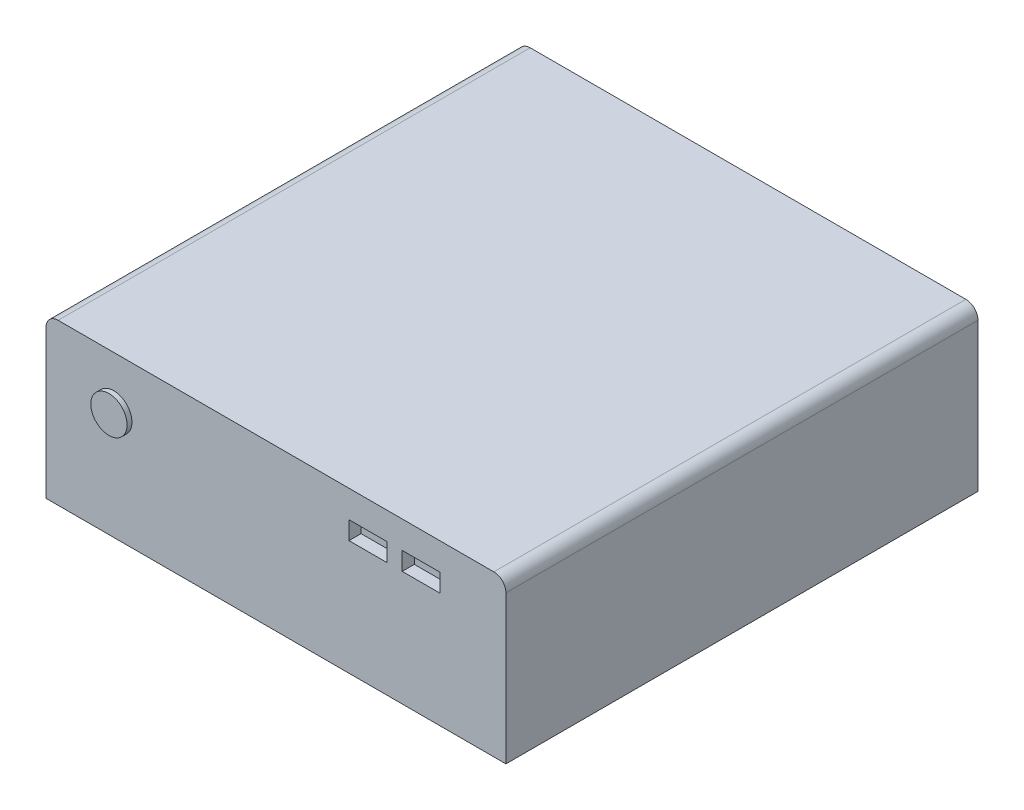
ISO-10303-21;
HEADER;
FILE_DESCRIPTION(('STEP AP214'),'2;1');
FILE_NAME('part.step','',(''),(''),'','','');
FILE_SCHEMA(('AUTOMOTIVE_DESIGN { 1 0 10303 214 1 1 1 1 }'));
ENDSEC;
DATA;
#1=APPLICATION_CONTEXT('core data for automotive mechanical design processes');
#2=APPLICATION_PROTOCOL_DEFINITION('international standard','automotive_design',2000,#1);
#3=PRODUCT_CONTEXT('',#1,'mechanical');
#4=PRODUCT('Part','Part','',(#3));
#5=PRODUCT_RELATED_PRODUCT_CATEGORY('part','',(#4));
#6=PRODUCT_DEFINITION_FORMATION('','',#4);
#7=PRODUCT_DEFINITION_CONTEXT('part definition',#1,'design');
#8=PRODUCT_DEFINITION('design','',#6,#7);
#9=PRODUCT_DEFINITION_SHAPE('','',#8);
#10=(LENGTH_UNIT() NAMED_UNIT(*) SI_UNIT(.MILLI.,.METRE.));
#11=(NAMED_UNIT(*) PLANE_ANGLE_UNIT() SI_UNIT($,.RADIAN.));
#12=(NAMED_UNIT(*) SI_UNIT($,.STERADIAN.) SOLID_ANGLE_UNIT());
#13=UNCERTAINTY_MEASURE_WITH_UNIT(LENGTH_MEASURE(1.E-05),#10,'distance_accuracy_value','');
#14=(GEOMETRIC_REPRESENTATION_CONTEXT(3) GLOBAL_UNCERTAINTY_ASSIGNED_CONTEXT((#13)) GLOBAL_UNIT_ASSIGNED_CONTEXT((#10,
#11,#12)) REPRESENTATION_CONTEXT('',''));
#15=CARTESIAN_POINT('',(0.,0.,0.));
#16=DIRECTION('',(0.,0.,1.));
#17=DIRECTION('',(1.,0.,0.));
#18=AXIS2_PLACEMENT_3D('',#15,#16,#17);
#19=CARTESIAN_POINT('',(-95.,66.2,97.5));
#20=DIRECTION('',(0.,0.,-1.));
#21=DIRECTION('',(-1.,0.,0.));
#22=AXIS2_PLACEMENT_3D('',#19,#20,#21);
#23=PLANE('',#22);
#24=DIRECTION('',(1.,0.,0.));
#25=VECTOR('',#24,1.);
#26=CARTESIAN_POINT('',(67.85,47.45,97.5));
#27=LINE('',#26,#25);
#28=CARTESIAN_POINT('',(52.15,47.45,97.5));
#29=VERTEX_POINT('',#28);
#30=CARTESIAN_POINT('',(67.85,47.45,97.5));
#31=VERTEX_POINT('',#30);
#32=EDGE_CURVE('E162',#29,#31,#27,.T.);
#33=ORIENTED_EDGE('',*,*,#32,.F.);
#34=DIRECTION('',(0.,-1.,0.));
#35=VECTOR('',#34,1.);
#36=CARTESIAN_POINT('',(52.15,47.45,97.5));
#37=LINE('',#36,#35);
#38=CARTESIAN_POINT('',(52.15,54.95,97.5));
#39=VERTEX_POINT('',#38);
#40=EDGE_CURVE('E47',#39,#29,#37,.T.);
#41=ORIENTED_EDGE('',*,*,#40,.F.);
#42=DIRECTION('',(-1.,0.,0.));
#43=VECTOR('',#42,1.);
#44=CARTESIAN_POINT('',(67.85,54.95,97.5));
#45=LINE('',#44,#43);
#46=CARTESIAN_POINT('',(67.85,54.95,97.5));
#47=VERTEX_POINT('',#46);
#48=EDGE_CURVE('E153',#47,#39,#45,.T.);
#49=ORIENTED_EDGE('',*,*,#48,.F.);
#50=DIRECTION('',(0.,1.,0.));
#51=VECTOR('',#50,1.);
#52=CARTESIAN_POINT('',(67.85,47.45,97.5));
#53=LINE('',#52,#51);
#54=EDGE_CURVE('E156',#31,#47,#53,.T.);
#55=ORIENTED_EDGE('',*,*,#54,.F.);
#56=EDGE_LOOP('',(#33,#41,#49,#55));
#57=FACE_BOUND('',#56,.T.);
#58=DIRECTION('',(1.,0.,0.));
#59=VECTOR('',#58,1.);
#60=CARTESIAN_POINT('',(45.85,47.45,97.5));
#61=LINE('',#60,#59);
#62=CARTESIAN_POINT('',(30.15,47.45,97.5));
#63=VERTEX_POINT('',#62);
#64=CARTESIAN_POINT('',(45.85,47.45,97.5));
#65=VERTEX_POINT('',#64);
#66=EDGE_CURVE('E186',#63,#65,#61,.T.);
#67=ORIENTED_EDGE('',*,*,#66,.F.);
#68=DIRECTION('',(0.,-1.,0.));
#69=VECTOR('',#68,1.);
#70=CARTESIAN_POINT('',(30.15,47.45,97.5));
#71=LINE('',#70,#69);
#72=CARTESIAN_POINT('',(30.15,54.95,97.5));
#73=VERTEX_POINT('',#72);
#74=EDGE_CURVE('E55',#73,#63,#71,.T.);
#75=ORIENTED_EDGE('',*,*,#74,.F.);
#76=DIRECTION('',(-1.,0.,0.));
#77=VECTOR('',#76,1.);
#78=CARTESIAN_POINT('',(45.85,54.95,97.5));
#79=LINE('',#78,#77);
#80=CARTESIAN_POINT('',(45.85,54.95,97.5));
#81=VERTEX_POINT('',#80);
#82=EDGE_CURVE('E175',#81,#73,#79,.T.);
#83=ORIENTED_EDGE('',*,*,#82,.F.);
#84=DIRECTION('',(0.,1.,0.));
#85=VECTOR('',#84,1.);
#86=CARTESIAN_POINT('',(45.85,47.45,97.5));
#87=LINE('',#86,#85);
#88=EDGE_CURVE('E189',#65,#81,#87,.T.);
#89=ORIENTED_EDGE('',*,*,#88,.F.);
#90=EDGE_LOOP('',(#67,#75,#83,#89));
#91=FACE_BOUND('',#90,.T.);
#92=DIRECTION('',(0.,-1.,0.));
#93=VECTOR('',#92,1.);
#94=CARTESIAN_POINT('',(95.,66.2,97.5));
#95=LINE('',#94,#93);
#96=CARTESIAN_POINT('',(95.,61.2,97.5));
#97=VERTEX_POINT('',#96);
#98=CARTESIAN_POINT('',(95.,0.,97.5));
#99=VERTEX_POINT('',#98);
#100=EDGE_CURVE('E236',#97,#99,#95,.T.);
#101=ORIENTED_EDGE('',*,*,#100,.F.);
#102=CARTESIAN_POINT('',(90.,61.2,97.5));
#103=DIRECTION('',(0.,0.,-1.));
#104=DIRECTION('',(-1.,0.,0.));
#105=AXIS2_PLACEMENT_3D('',#102,#103,#104);
#106=CIRCLE('',#105,5.);
#107=CARTESIAN_POINT('',(90.,66.2,97.5));
#108=VERTEX_POINT('',#107);
#109=EDGE_CURVE('E268',#97,#108,#106,.F.);
#110=ORIENTED_EDGE('',*,*,#109,.T.);
#111=DIRECTION('',(1.,0.,0.));
#112=VECTOR('',#111,1.);
#113=CARTESIAN_POINT('',(-95.,66.2,97.5));
#114=LINE('',#113,#112);
#115=CARTESIAN_POINT('',(-90.,66.2,97.5));
#116=VERTEX_POINT('',#115);
#117=EDGE_CURVE('E232',#116,#108,#114,.T.);
#118=ORIENTED_EDGE('',*,*,#117,.F.);
#119=CARTESIAN_POINT('',(-90.,61.2,97.5));
#120=DIRECTION('',(0.,0.,-1.));
#121=DIRECTION('',(-1.,0.,0.));
#122=AXIS2_PLACEMENT_3D('',#119,#120,#121);
#123=CIRCLE('',#122,5.);
#124=CARTESIAN_POINT('',(-95.,61.2,97.5));
#125=VERTEX_POINT('',#124);
#126=EDGE_CURVE('E266',#116,#125,#123,.F.);
#127=ORIENTED_EDGE('',*,*,#126,.T.);
#128=DIRECTION('',(0.,-1.,0.));
#129=VECTOR('',#128,1.);
#130=CARTESIAN_POINT('',(-95.,66.2,97.5));
#131=LINE('',#130,#129);
#132=CARTESIAN_POINT('',(-95.,0.,97.5));
#133=VERTEX_POINT('',#132);
#134=EDGE_CURVE('E248',#125,#133,#131,.T.);
#135=ORIENTED_EDGE('',*,*,#134,.T.);
#136=DIRECTION('',(1.,0.,0.));
#137=VECTOR('',#136,1.);
#138=CARTESIAN_POINT('',(-95.,0.,97.5));
#139=LINE('',#138,#137);
#140=EDGE_CURVE('E233',#133,#99,#139,.T.);
#141=ORIENTED_EDGE('',*,*,#140,.T.);
#142=EDGE_LOOP('',(#101,#110,#118,#127,#135,#141));
#143=FACE_BOUND('',#142,.T.);
#144=CARTESIAN_POINT('',(-67.,45.,97.5));
#145=DIRECTION('',(0.,0.,-1.));
#146=DIRECTION('',(-1.,0.,0.));
#147=AXIS2_PLACEMENT_3D('',#144,#145,#146);
#148=CIRCLE('',#147,7.5);
#149=CARTESIAN_POINT('',(-74.5,45.,97.5));
#150=VERTEX_POINT('',#149);
#151=EDGE_CURVE('E11',#150,#150,#148,.F.);
#152=ORIENTED_EDGE('',*,*,#151,.F.);
#153=EDGE_LOOP('',(#152));
#154=FACE_BOUND('',#153,.T.);
#155=ADVANCED_FACE('F32',(#57,#91,#143,#154),#23,.F.);
#156=CARTESIAN_POINT('',(95.,66.2,-97.5));
#157=DIRECTION('',(-1.,0.,0.));
#158=DIRECTION('',(0.,0.,1.));
#159=AXIS2_PLACEMENT_3D('',#156,#157,#158);
#160=PLANE('',#159);
#161=DIRECTION('',(0.,-1.,0.));
#162=VECTOR('',#161,1.);
#163=CARTESIAN_POINT('',(95.,66.2,-97.5));
#164=LINE('',#163,#162);
#165=CARTESIAN_POINT('',(95.,61.2,-97.5));
#166=VERTEX_POINT('',#165);
#167=CARTESIAN_POINT('',(95.,0.,-97.5));
#168=VERTEX_POINT('',#167);
#169=EDGE_CURVE('E252',#166,#168,#164,.T.);
#170=ORIENTED_EDGE('',*,*,#169,.F.);
#171=DIRECTION('',(0.,0.,-1.));
#172=VECTOR('',#171,1.);
#173=CARTESIAN_POINT('',(95.,61.2,97.5));
#174=LINE('',#173,#172);
#175=EDGE_CURVE('E264',#166,#97,#174,.F.);
#176=ORIENTED_EDGE('',*,*,#175,.T.);
#177=ORIENTED_EDGE('',*,*,#100,.T.);
#178=DIRECTION('',(0.,0.,-1.));
#179=VECTOR('',#178,1.);
#180=CARTESIAN_POINT('',(95.,0.,-97.5));
#181=LINE('',#180,#179);
#182=EDGE_CURVE('E226',#99,#168,#181,.T.);
#183=ORIENTED_EDGE('',*,*,#182,.T.);
#184=EDGE_LOOP('',(#170,#176,#177,#183));
#185=FACE_BOUND('',#184,.T.);
#186=ADVANCED_FACE('F295',(#185),#160,.F.);
#187=CARTESIAN_POINT('',(-95.,66.2,-97.5));
#188=DIRECTION('',(0.,0.,1.));
#189=DIRECTION('',(1.,0.,0.));
#190=AXIS2_PLACEMENT_3D('',#187,#188,#189);
#191=PLANE('',#190);
#192=DIRECTION('',(-1.,0.,0.));
#193=VECTOR('',#192,1.);
#194=CARTESIAN_POINT('',(-95.,66.2,-97.5));
#195=LINE('',#194,#193);
#196=CARTESIAN_POINT('',(90.,66.2,-97.5));
#197=VERTEX_POINT('',#196);
#198=CARTESIAN_POINT('',(-90.,66.2,-97.5));
#199=VERTEX_POINT('',#198);
#200=EDGE_CURVE('E229',#197,#199,#195,.T.);
#201=ORIENTED_EDGE('',*,*,#200,.F.);
#202=CARTESIAN_POINT('',(90.,61.2,-97.5));
#203=DIRECTION('',(0.,0.,1.));
#204=DIRECTION('',(1.,0.,0.));
#205=AXIS2_PLACEMENT_3D('',#202,#203,#204);
#206=CIRCLE('',#205,5.);
#207=EDGE_CURVE('E262',#197,#166,#206,.F.);
#208=ORIENTED_EDGE('',*,*,#207,.T.);
#209=ORIENTED_EDGE('',*,*,#169,.T.);
#210=DIRECTION('',(-1.,0.,0.));
#211=VECTOR('',#210,1.);
#212=CARTESIAN_POINT('',(-95.,0.,-97.5));
#213=LINE('',#212,#211);
#214=CARTESIAN_POINT('',(-95.,0.,-97.5));
#215=VERTEX_POINT('',#214);
#216=EDGE_CURVE('E239',#168,#215,#213,.T.);
#217=ORIENTED_EDGE('',*,*,#216,.T.);
#218=DIRECTION('',(0.,-1.,0.));
#219=VECTOR('',#218,1.);
#220=CARTESIAN_POINT('',(-95.,66.2,-97.5));
#221=LINE('',#220,#219);
#222=CARTESIAN_POINT('',(-95.,61.2,-97.5));
#223=VERTEX_POINT('',#222);
#224=EDGE_CURVE('E250',#223,#215,#221,.T.);
#225=ORIENTED_EDGE('',*,*,#224,.F.);
#226=CARTESIAN_POINT('',(-90.,61.2,-97.5));
#227=DIRECTION('',(0.,0.,1.));
#228=DIRECTION('',(1.,0.,0.));
#229=AXIS2_PLACEMENT_3D('',#226,#227,#228);
#230=CIRCLE('',#229,5.);
#231=EDGE_CURVE('E260',#223,#199,#230,.F.);
#232=ORIENTED_EDGE('',*,*,#231,.T.);
#233=EDGE_LOOP('',(#201,#208,#209,#217,#225,#232));
#234=FACE_BOUND('',#233,.T.);
#235=ADVANCED_FACE('F278',(#234),#191,.F.);
#236=CARTESIAN_POINT('',(-95.,66.2,-97.5));
#237=DIRECTION('',(1.,0.,0.));
#238=DIRECTION('',(0.,0.,-1.));
#239=AXIS2_PLACEMENT_3D('',#236,#237,#238);
#240=PLANE('',#239);
#241=ORIENTED_EDGE('',*,*,#134,.F.);
#242=DIRECTION('',(0.,0.,1.));
#243=VECTOR('',#242,1.);
#244=CARTESIAN_POINT('',(-95.,61.2,-97.5));
#245=LINE('',#244,#243);
#246=EDGE_CURVE('E40',#125,#223,#245,.F.);
#247=ORIENTED_EDGE('',*,*,#246,.T.);
#248=ORIENTED_EDGE('',*,*,#224,.T.);
#249=DIRECTION('',(0.,0.,1.));
#250=VECTOR('',#249,1.);
#251=CARTESIAN_POINT('',(-95.,0.,-97.5));
#252=LINE('',#251,#250);
#253=EDGE_CURVE('E242',#215,#133,#252,.T.);
#254=ORIENTED_EDGE('',*,*,#253,.T.);
#255=EDGE_LOOP('',(#241,#247,#248,#254));
#256=FACE_BOUND('',#255,.T.);
#257=ADVANCED_FACE('F273',(#256),#240,.F.);
#258=CARTESIAN_POINT('',(0.,66.2,0.));
#259=DIRECTION('',(0.,1.,0.));
#260=DIRECTION('',(0.,0.,1.));
#261=AXIS2_PLACEMENT_3D('',#258,#259,#260);
#262=PLANE('',#261);
#263=ORIENTED_EDGE('',*,*,#117,.T.);
#264=DIRECTION('',(0.,0.,-1.));
#265=VECTOR('',#264,1.);
#266=CARTESIAN_POINT('',(90.,66.2,-97.5));
#267=LINE('',#266,#265);
#268=EDGE_CURVE('E257',#108,#197,#267,.T.);
#269=ORIENTED_EDGE('',*,*,#268,.T.);
#270=ORIENTED_EDGE('',*,*,#200,.T.);
#271=DIRECTION('',(0.,0.,1.));
#272=VECTOR('',#271,1.);
#273=CARTESIAN_POINT('',(-90.,66.2,97.5));
#274=LINE('',#273,#272);
#275=EDGE_CURVE('E254',#199,#116,#274,.T.);
#276=ORIENTED_EDGE('',*,*,#275,.T.);
#277=EDGE_LOOP('',(#263,#269,#270,#276));
#278=FACE_BOUND('',#277,.T.);
#279=ADVANCED_FACE('F284',(#278),#262,.T.);
#280=CARTESIAN_POINT('',(0.,0.,0.));
#281=DIRECTION('',(0.,1.,0.));
#282=DIRECTION('',(0.,0.,1.));
#283=AXIS2_PLACEMENT_3D('',#280,#281,#282);
#284=PLANE('',#283);
#285=CARTESIAN_POINT('',(-85.725,0.,-45.));
#286=DIRECTION('',(0.,-1.,0.));
#287=DIRECTION('',(0.,0.,-1.));
#288=AXIS2_PLACEMENT_3D('',#285,#286,#287);
#289=CIRCLE('',#288,1.70000000000001);
#290=CARTESIAN_POINT('',(-85.725,0.,-46.7));
#291=VERTEX_POINT('',#290);
#292=EDGE_CURVE('E204',#291,#291,#289,.T.);
#293=ORIENTED_EDGE('',*,*,#292,.F.);
#294=EDGE_LOOP('',(#293));
#295=FACE_BOUND('',#294,.T.);
#296=CARTESIAN_POINT('',(85.725,0.,-45.));
#297=DIRECTION('',(0.,-1.,0.));
#298=DIRECTION('',(0.,0.,-1.));
#299=AXIS2_PLACEMENT_3D('',#296,#297,#298);
#300=CIRCLE('',#299,1.70000000000001);
#301=CARTESIAN_POINT('',(85.725,0.,-46.7));
#302=VERTEX_POINT('',#301);
#303=EDGE_CURVE('E208',#302,#302,#300,.T.);
#304=ORIENTED_EDGE('',*,*,#303,.F.);
#305=EDGE_LOOP('',(#304));
#306=FACE_BOUND('',#305,.T.);
#307=CARTESIAN_POINT('',(85.725,0.,45.));
#308=DIRECTION('',(0.,-1.,0.));
#309=DIRECTION('',(0.,0.,-1.));
#310=AXIS2_PLACEMENT_3D('',#307,#308,#309);
#311=CIRCLE('',#310,1.70000000000001);
#312=CARTESIAN_POINT('',(85.725,0.,43.3));
#313=VERTEX_POINT('',#312);
#314=EDGE_CURVE('E214',#313,#313,#311,.T.);
#315=ORIENTED_EDGE('',*,*,#314,.F.);
#316=EDGE_LOOP('',(#315));
#317=FACE_BOUND('',#316,.T.);
#318=CARTESIAN_POINT('',(-85.725,0.,45.));
#319=DIRECTION('',(0.,-1.,0.));
#320=DIRECTION('',(0.,0.,-1.));
#321=AXIS2_PLACEMENT_3D('',#318,#319,#320);
#322=CIRCLE('',#321,1.70000000000001);
#323=CARTESIAN_POINT('',(-85.725,0.,43.3));
#324=VERTEX_POINT('',#323);
#325=EDGE_CURVE('E220',#324,#324,#322,.T.);
#326=ORIENTED_EDGE('',*,*,#325,.F.);
#327=EDGE_LOOP('',(#326));
#328=FACE_BOUND('',#327,.T.);
#329=ORIENTED_EDGE('',*,*,#182,.F.);
#330=ORIENTED_EDGE('',*,*,#140,.F.);
#331=ORIENTED_EDGE('',*,*,#253,.F.);
#332=ORIENTED_EDGE('',*,*,#216,.F.);
#333=EDGE_LOOP('',(#329,#330,#331,#332));
#334=FACE_BOUND('',#333,.T.);
#335=ADVANCED_FACE('F299',(#295,#306,#317,#328,#334),#284,.F.);
#336=CARTESIAN_POINT('',(90.,61.2,0.));
#337=DIRECTION('',(0.,0.,1.));
#338=DIRECTION('',(1.,0.,0.));
#339=AXIS2_PLACEMENT_3D('',#336,#337,#338);
#340=CYLINDRICAL_SURFACE('',#339,5.);
#341=ORIENTED_EDGE('',*,*,#109,.F.);
#342=ORIENTED_EDGE('',*,*,#175,.F.);
#343=ORIENTED_EDGE('',*,*,#207,.F.);
#344=ORIENTED_EDGE('',*,*,#268,.F.);
#345=EDGE_LOOP('',(#341,#342,#343,#344));
#346=FACE_BOUND('',#345,.T.);
#347=ADVANCED_FACE('F292',(#346),#340,.T.);
#348=CARTESIAN_POINT('',(-90.,61.2,0.));
#349=DIRECTION('',(0.,0.,-1.));
#350=DIRECTION('',(-1.,0.,0.));
#351=AXIS2_PLACEMENT_3D('',#348,#349,#350);
#352=CYLINDRICAL_SURFACE('',#351,5.);
#353=ORIENTED_EDGE('',*,*,#231,.F.);
#354=ORIENTED_EDGE('',*,*,#246,.F.);
#355=ORIENTED_EDGE('',*,*,#126,.F.);
#356=ORIENTED_EDGE('',*,*,#275,.F.);
#357=EDGE_LOOP('',(#353,#354,#355,#356));
#358=FACE_BOUND('',#357,.T.);
#359=ADVANCED_FACE('F34',(#358),#352,.T.);
#360=CARTESIAN_POINT('',(-85.725,5.,45.));
#361=DIRECTION('',(0.,-1.,0.));
#362=DIRECTION('',(0.,0.,-1.));
#363=AXIS2_PLACEMENT_3D('',#360,#361,#362);
#364=CYLINDRICAL_SURFACE('',#363,1.70000000000001);
#365=CARTESIAN_POINT('',(-85.725,5.,45.));
#366=DIRECTION('',(0.,-1.,0.));
#367=DIRECTION('',(0.,0.,-1.));
#368=AXIS2_PLACEMENT_3D('',#365,#366,#367);
#369=CIRCLE('',#368,1.70000000000001);
#370=CARTESIAN_POINT('',(-85.725,5.,43.3));
#371=VERTEX_POINT('',#370);
#372=EDGE_CURVE('E223',#371,#371,#369,.T.);
#373=ORIENTED_EDGE('',*,*,#372,.F.);
#374=EDGE_LOOP('',(#373));
#375=FACE_BOUND('',#374,.T.);
#376=ORIENTED_EDGE('',*,*,#325,.T.);
#377=EDGE_LOOP('',(#376));
#378=FACE_BOUND('',#377,.T.);
#379=ADVANCED_FACE('F349',(#375,#378),#364,.F.);
#380=CARTESIAN_POINT('',(-85.725,5.,45.));
#381=DIRECTION('',(0.,-1.,0.));
#382=DIRECTION('',(0.,0.,-1.));
#383=AXIS2_PLACEMENT_3D('',#380,#381,#382);
#384=PLANE('',#383);
#385=ORIENTED_EDGE('',*,*,#372,.T.);
#386=EDGE_LOOP('',(#385));
#387=FACE_BOUND('',#386,.T.);
#388=ADVANCED_FACE('F361',(#387),#384,.T.);
#389=CARTESIAN_POINT('',(85.725,5.,45.));
#390=DIRECTION('',(0.,-1.,0.));
#391=DIRECTION('',(0.,0.,-1.));
#392=AXIS2_PLACEMENT_3D('',#389,#390,#391);
#393=CYLINDRICAL_SURFACE('',#392,1.70000000000001);
#394=CARTESIAN_POINT('',(85.725,5.,45.));
#395=DIRECTION('',(0.,-1.,0.));
#396=DIRECTION('',(0.,0.,-1.));
#397=AXIS2_PLACEMENT_3D('',#394,#395,#396);
#398=CIRCLE('',#397,1.70000000000001);
#399=CARTESIAN_POINT('',(85.725,5.,43.3));
#400=VERTEX_POINT('',#399);
#401=EDGE_CURVE('E217',#400,#400,#398,.T.);
#402=ORIENTED_EDGE('',*,*,#401,.F.);
#403=EDGE_LOOP('',(#402));
#404=FACE_BOUND('',#403,.T.);
#405=ORIENTED_EDGE('',*,*,#314,.T.);
#406=EDGE_LOOP('',(#405));
#407=FACE_BOUND('',#406,.T.);
#408=ADVANCED_FACE('F371',(#404,#407),#393,.F.);
#409=CARTESIAN_POINT('',(85.725,5.,45.));
#410=DIRECTION('',(0.,-1.,0.));
#411=DIRECTION('',(0.,0.,-1.));
#412=AXIS2_PLACEMENT_3D('',#409,#410,#411);
#413=PLANE('',#412);
#414=ORIENTED_EDGE('',*,*,#401,.T.);
#415=EDGE_LOOP('',(#414));
#416=FACE_BOUND('',#415,.T.);
#417=ADVANCED_FACE('F381',(#416),#413,.T.);
#418=CARTESIAN_POINT('',(85.725,5.,-45.));
#419=DIRECTION('',(0.,-1.,0.));
#420=DIRECTION('',(0.,0.,-1.));
#421=AXIS2_PLACEMENT_3D('',#418,#419,#420);
#422=CYLINDRICAL_SURFACE('',#421,1.70000000000001);
#423=CARTESIAN_POINT('',(85.725,5.,-45.));
#424=DIRECTION('',(0.,-1.,0.));
#425=DIRECTION('',(0.,0.,-1.));
#426=AXIS2_PLACEMENT_3D('',#423,#424,#425);
#427=CIRCLE('',#426,1.70000000000001);
#428=CARTESIAN_POINT('',(85.725,5.,-46.7));
#429=VERTEX_POINT('',#428);
#430=EDGE_CURVE('E211',#429,#429,#427,.T.);
#431=ORIENTED_EDGE('',*,*,#430,.F.);
#432=EDGE_LOOP('',(#431));
#433=FACE_BOUND('',#432,.T.);
#434=ORIENTED_EDGE('',*,*,#303,.T.);
#435=EDGE_LOOP('',(#434));
#436=FACE_BOUND('',#435,.T.);
#437=ADVANCED_FACE('F391',(#433,#436),#422,.F.);
#438=CARTESIAN_POINT('',(85.725,5.,-45.));
#439=DIRECTION('',(0.,-1.,0.));
#440=DIRECTION('',(0.,0.,-1.));
#441=AXIS2_PLACEMENT_3D('',#438,#439,#440);
#442=PLANE('',#441);
#443=ORIENTED_EDGE('',*,*,#430,.T.);
#444=EDGE_LOOP('',(#443));
#445=FACE_BOUND('',#444,.T.);
#446=ADVANCED_FACE('F401',(#445),#442,.T.);
#447=CARTESIAN_POINT('',(-85.725,5.,-45.));
#448=DIRECTION('',(0.,-1.,0.));
#449=DIRECTION('',(0.,0.,-1.));
#450=AXIS2_PLACEMENT_3D('',#447,#448,#449);
#451=CYLINDRICAL_SURFACE('',#450,1.70000000000001);
#452=CARTESIAN_POINT('',(-85.725,5.,-45.));
#453=DIRECTION('',(0.,-1.,0.));
#454=DIRECTION('',(0.,0.,-1.));
#455=AXIS2_PLACEMENT_3D('',#452,#453,#454);
#456=CIRCLE('',#455,1.70000000000001);
#457=CARTESIAN_POINT('',(-85.725,5.,-46.7));
#458=VERTEX_POINT('',#457);
#459=EDGE_CURVE('E205',#458,#458,#456,.T.);
#460=ORIENTED_EDGE('',*,*,#459,.F.);
#461=EDGE_LOOP('',(#460));
#462=FACE_BOUND('',#461,.T.);
#463=ORIENTED_EDGE('',*,*,#292,.T.);
#464=EDGE_LOOP('',(#463));
#465=FACE_BOUND('',#464,.T.);
#466=ADVANCED_FACE('F411',(#462,#465),#451,.F.);
#467=CARTESIAN_POINT('',(-85.725,5.,-45.));
#468=DIRECTION('',(0.,-1.,0.));
#469=DIRECTION('',(0.,0.,-1.));
#470=AXIS2_PLACEMENT_3D('',#467,#468,#469);
#471=PLANE('',#470);
#472=ORIENTED_EDGE('',*,*,#459,.T.);
#473=EDGE_LOOP('',(#472));
#474=FACE_BOUND('',#473,.T.);
#475=ADVANCED_FACE('F421',(#474),#471,.T.);
#476=CARTESIAN_POINT('',(-67.,45.,99.5));
#477=DIRECTION('',(0.,0.,-1.));
#478=DIRECTION('',(-1.,0.,0.));
#479=AXIS2_PLACEMENT_3D('',#476,#477,#478);
#480=CYLINDRICAL_SURFACE('',#479,7.5);
#481=CARTESIAN_POINT('',(-67.,45.,99.5));
#482=DIRECTION('',(0.,0.,1.));
#483=DIRECTION('',(1.,0.,0.));
#484=AXIS2_PLACEMENT_3D('',#481,#482,#483);
#485=CIRCLE('',#484,7.5);
#486=CARTESIAN_POINT('',(-59.5,45.,99.5));
#487=VERTEX_POINT('',#486);
#488=EDGE_CURVE('E196',#487,#487,#485,.T.);
#489=ORIENTED_EDGE('',*,*,#488,.F.);
#490=EDGE_LOOP('',(#489));
#491=FACE_BOUND('',#490,.T.);
#492=ORIENTED_EDGE('',*,*,#151,.T.);
#493=EDGE_LOOP('',(#492));
#494=FACE_BOUND('',#493,.T.);
#495=ADVANCED_FACE('F431',(#491,#494),#480,.T.);
#496=CARTESIAN_POINT('',(-67.,45.,99.5));
#497=DIRECTION('',(0.,0.,1.));
#498=DIRECTION('',(1.,0.,0.));
#499=AXIS2_PLACEMENT_3D('',#496,#497,#498);
#500=PLANE('',#499);
#501=ORIENTED_EDGE('',*,*,#488,.T.);
#502=EDGE_LOOP('',(#501));
#503=FACE_BOUND('',#502,.T.);
#504=ADVANCED_FACE('F442',(#503),#500,.T.);
#505=CARTESIAN_POINT('',(30.15,47.45,92.5));
#506=DIRECTION('',(-1.,0.,0.));
#507=DIRECTION('',(0.,0.,1.));
#508=AXIS2_PLACEMENT_3D('',#505,#506,#507);
#509=PLANE('',#508);
#510=ORIENTED_EDGE('',*,*,#74,.T.);
#511=DIRECTION('',(0.,0.,1.));
#512=VECTOR('',#511,1.);
#513=CARTESIAN_POINT('',(30.15,47.45,92.5));
#514=LINE('',#513,#512);
#515=CARTESIAN_POINT('',(30.15,47.45,92.5));
#516=VERTEX_POINT('',#515);
#517=EDGE_CURVE('E184',#516,#63,#514,.T.);
#518=ORIENTED_EDGE('',*,*,#517,.F.);
#519=DIRECTION('',(0.,-1.,0.));
#520=VECTOR('',#519,1.);
#521=CARTESIAN_POINT('',(30.15,47.45,92.5));
#522=LINE('',#521,#520);
#523=CARTESIAN_POINT('',(30.15,54.95,92.5));
#524=VERTEX_POINT('',#523);
#525=EDGE_CURVE('E171',#524,#516,#522,.T.);
#526=ORIENTED_EDGE('',*,*,#525,.F.);
#527=DIRECTION('',(0.,0.,1.));
#528=VECTOR('',#527,1.);
#529=CARTESIAN_POINT('',(30.15,54.95,92.5));
#530=LINE('',#529,#528);
#531=EDGE_CURVE('E194',#524,#73,#530,.T.);
#532=ORIENTED_EDGE('',*,*,#531,.T.);
#533=EDGE_LOOP('',(#510,#518,#526,#532));
#534=FACE_BOUND('',#533,.T.);
#535=ADVANCED_FACE('F451',(#534),#509,.F.);
#536=CARTESIAN_POINT('',(45.85,54.95,92.5));
#537=DIRECTION('',(0.,1.,0.));
#538=DIRECTION('',(0.,0.,1.));
#539=AXIS2_PLACEMENT_3D('',#536,#537,#538);
#540=PLANE('',#539);
#541=ORIENTED_EDGE('',*,*,#82,.T.);
#542=ORIENTED_EDGE('',*,*,#531,.F.);
#543=DIRECTION('',(-1.,0.,0.));
#544=VECTOR('',#543,1.);
#545=CARTESIAN_POINT('',(45.85,54.95,92.5));
#546=LINE('',#545,#544);
#547=CARTESIAN_POINT('',(45.85,54.95,92.5));
#548=VERTEX_POINT('',#547);
#549=EDGE_CURVE('E181',#548,#524,#546,.T.);
#550=ORIENTED_EDGE('',*,*,#549,.F.);
#551=DIRECTION('',(0.,0.,1.));
#552=VECTOR('',#551,1.);
#553=CARTESIAN_POINT('',(45.85,54.95,92.5));
#554=LINE('',#553,#552);
#555=EDGE_CURVE('E197',#548,#81,#554,.T.);
#556=ORIENTED_EDGE('',*,*,#555,.T.);
#557=EDGE_LOOP('',(#541,#542,#550,#556));
#558=FACE_BOUND('',#557,.T.);
#559=ADVANCED_FACE('F465',(#558),#540,.F.);
#560=CARTESIAN_POINT('',(45.85,47.45,92.5));
#561=DIRECTION('',(1.,0.,0.));
#562=DIRECTION('',(0.,0.,-1.));
#563=AXIS2_PLACEMENT_3D('',#560,#561,#562);
#564=PLANE('',#563);
#565=ORIENTED_EDGE('',*,*,#88,.T.);
#566=ORIENTED_EDGE('',*,*,#555,.F.);
#567=DIRECTION('',(0.,1.,0.));
#568=VECTOR('',#567,1.);
#569=CARTESIAN_POINT('',(45.85,47.45,92.5));
#570=LINE('',#569,#568);
#571=CARTESIAN_POINT('',(45.85,47.45,92.5));
#572=VERTEX_POINT('',#571);
#573=EDGE_CURVE('E178',#572,#548,#570,.T.);
#574=ORIENTED_EDGE('',*,*,#573,.F.);
#575=DIRECTION('',(0.,0.,1.));
#576=VECTOR('',#575,1.);
#577=CARTESIAN_POINT('',(45.85,47.45,92.5));
#578=LINE('',#577,#576);
#579=EDGE_CURVE('E199',#572,#65,#578,.T.);
#580=ORIENTED_EDGE('',*,*,#579,.T.);
#581=EDGE_LOOP('',(#565,#566,#574,#580));
#582=FACE_BOUND('',#581,.T.);
#583=ADVANCED_FACE('F474',(#582),#564,.F.);
#584=CARTESIAN_POINT('',(45.85,47.45,92.5));
#585=DIRECTION('',(0.,-1.,0.));
#586=DIRECTION('',(0.,0.,-1.));
#587=AXIS2_PLACEMENT_3D('',#584,#585,#586);
#588=PLANE('',#587);
#589=ORIENTED_EDGE('',*,*,#66,.T.);
#590=ORIENTED_EDGE('',*,*,#579,.F.);
#591=DIRECTION('',(1.,0.,0.));
#592=VECTOR('',#591,1.);
#593=CARTESIAN_POINT('',(45.85,47.45,92.5));
#594=LINE('',#593,#592);
#595=EDGE_CURVE('E174',#516,#572,#594,.T.);
#596=ORIENTED_EDGE('',*,*,#595,.F.);
#597=ORIENTED_EDGE('',*,*,#517,.T.);
#598=EDGE_LOOP('',(#589,#590,#596,#597));
#599=FACE_BOUND('',#598,.T.);
#600=ADVANCED_FACE('F484',(#599),#588,.F.);
#601=CARTESIAN_POINT('',(0.,0.,92.5));
#602=DIRECTION('',(0.,0.,1.));
#603=DIRECTION('',(1.,0.,0.));
#604=AXIS2_PLACEMENT_3D('',#601,#602,#603);
#605=PLANE('',#604);
#606=ORIENTED_EDGE('',*,*,#525,.T.);
#607=ORIENTED_EDGE('',*,*,#595,.T.);
#608=ORIENTED_EDGE('',*,*,#573,.T.);
#609=ORIENTED_EDGE('',*,*,#549,.T.);
#610=EDGE_LOOP('',(#606,#607,#608,#609));
#611=FACE_BOUND('',#610,.T.);
#612=ADVANCED_FACE('F494',(#611),#605,.T.);
#613=CARTESIAN_POINT('',(52.15,47.45,92.5));
#614=DIRECTION('',(-1.,0.,0.));
#615=DIRECTION('',(0.,0.,1.));
#616=AXIS2_PLACEMENT_3D('',#613,#614,#615);
#617=PLANE('',#616);
#618=ORIENTED_EDGE('',*,*,#40,.T.);
#619=DIRECTION('',(0.,0.,1.));
#620=VECTOR('',#619,1.);
#621=CARTESIAN_POINT('',(52.15,47.45,92.5));
#622=LINE('',#621,#620);
#623=CARTESIAN_POINT('',(52.15,47.45,92.5));
#624=VERTEX_POINT('',#623);
#625=EDGE_CURVE('E131',#624,#29,#622,.T.);
#626=ORIENTED_EDGE('',*,*,#625,.F.);
#627=DIRECTION('',(0.,-1.,0.));
#628=VECTOR('',#627,1.);
#629=CARTESIAN_POINT('',(52.15,47.45,92.5));
#630=LINE('',#629,#628);
#631=CARTESIAN_POINT('',(52.15,54.95,92.5));
#632=VERTEX_POINT('',#631);
#633=EDGE_CURVE('E135',#632,#624,#630,.T.);
#634=ORIENTED_EDGE('',*,*,#633,.F.);
#635=DIRECTION('',(0.,0.,1.));
#636=VECTOR('',#635,1.);
#637=CARTESIAN_POINT('',(52.15,54.95,92.5));
#638=LINE('',#637,#636);
#639=EDGE_CURVE('E166',#632,#39,#638,.T.);
#640=ORIENTED_EDGE('',*,*,#639,.T.);
#641=EDGE_LOOP('',(#618,#626,#634,#640));
#642=FACE_BOUND('',#641,.T.);
#643=ADVANCED_FACE('F133',(#642),#617,.F.);
#644=CARTESIAN_POINT('',(67.85,54.95,92.5));
#645=DIRECTION('',(0.,1.,0.));
#646=DIRECTION('',(0.,0.,1.));
#647=AXIS2_PLACEMENT_3D('',#644,#645,#646);
#648=PLANE('',#647);
#649=ORIENTED_EDGE('',*,*,#48,.T.);
#650=ORIENTED_EDGE('',*,*,#639,.F.);
#651=DIRECTION('',(-1.,0.,0.));
#652=VECTOR('',#651,1.);
#653=CARTESIAN_POINT('',(67.85,54.95,92.5));
#654=LINE('',#653,#652);
#655=CARTESIAN_POINT('',(67.85,54.95,92.5));
#656=VERTEX_POINT('',#655);
#657=EDGE_CURVE('E141',#656,#632,#654,.T.);
#658=ORIENTED_EDGE('',*,*,#657,.F.);
#659=DIRECTION('',(0.,0.,1.));
#660=VECTOR('',#659,1.);
#661=CARTESIAN_POINT('',(67.85,54.95,92.5));
#662=LINE('',#661,#660);
#663=EDGE_CURVE('E168',#656,#47,#662,.T.);
#664=ORIENTED_EDGE('',*,*,#663,.T.);
#665=EDGE_LOOP('',(#649,#650,#658,#664));
#666=FACE_BOUND('',#665,.T.);
#667=ADVANCED_FACE('F513',(#666),#648,.F.);
#668=CARTESIAN_POINT('',(67.85,47.45,92.5));
#669=DIRECTION('',(1.,0.,0.));
#670=DIRECTION('',(0.,1.,0.));
#671=AXIS2_PLACEMENT_3D('',#668,#669,#670);
#672=PLANE('',#671);
#673=ORIENTED_EDGE('',*,*,#54,.T.);
#674=ORIENTED_EDGE('',*,*,#663,.F.);
#675=DIRECTION('',(0.,1.,0.));
#676=VECTOR('',#675,1.);
#677=CARTESIAN_POINT('',(67.85,47.45,92.5));
#678=LINE('',#677,#676);
#679=CARTESIAN_POINT('',(67.85,47.45,92.5));
#680=VERTEX_POINT('',#679);
#681=EDGE_CURVE('E149',#680,#656,#678,.T.);
#682=ORIENTED_EDGE('',*,*,#681,.F.);
#683=DIRECTION('',(0.,0.,1.));
#684=VECTOR('',#683,1.);
#685=CARTESIAN_POINT('',(67.85,47.45,92.5));
#686=LINE('',#685,#684);
#687=EDGE_CURVE('E140',#680,#31,#686,.T.);
#688=ORIENTED_EDGE('',*,*,#687,.T.);
#689=EDGE_LOOP('',(#673,#674,#682,#688));
#690=FACE_BOUND('',#689,.T.);
#691=ADVANCED_FACE('F522',(#690),#672,.F.);
#692=CARTESIAN_POINT('',(67.85,47.45,92.5));
#693=DIRECTION('',(0.,-1.,0.));
#694=DIRECTION('',(0.,0.,-1.));
#695=AXIS2_PLACEMENT_3D('',#692,#693,#694);
#696=PLANE('',#695);
#697=ORIENTED_EDGE('',*,*,#32,.T.);
#698=ORIENTED_EDGE('',*,*,#687,.F.);
#699=DIRECTION('',(1.,0.,0.));
#700=VECTOR('',#699,1.);
#701=CARTESIAN_POINT('',(67.85,47.45,92.5));
#702=LINE('',#701,#700);
#703=EDGE_CURVE('E144',#624,#680,#702,.T.);
#704=ORIENTED_EDGE('',*,*,#703,.F.);
#705=ORIENTED_EDGE('',*,*,#625,.T.);
#706=EDGE_LOOP('',(#697,#698,#704,#705));
#707=FACE_BOUND('',#706,.T.);
#708=ADVANCED_FACE('F145',(#707),#696,.F.);
#709=CARTESIAN_POINT('',(0.,0.,92.5));
#710=DIRECTION('',(0.,0.,1.));
#711=DIRECTION('',(1.,0.,0.));
#712=AXIS2_PLACEMENT_3D('',#709,#710,#711);
#713=PLANE('',#712);
#714=ORIENTED_EDGE('',*,*,#633,.T.);
#715=ORIENTED_EDGE('',*,*,#703,.T.);
#716=ORIENTED_EDGE('',*,*,#681,.T.);
#717=ORIENTED_EDGE('',*,*,#657,.T.);
#718=EDGE_LOOP('',(#714,#715,#716,#717));
#719=FACE_BOUND('',#718,.T.);
#720=ADVANCED_FACE('F151',(#719),#713,.T.);
#721=CLOSED_SHELL('',(#155,#186,#235,#257,#279,#335,#347,#359,#379,#388,#408,#417,#437,#446,
#466,#475,#495,#504,#535,#559,#583,#600,#612,#643,#667,#691,#708,#720));
#722=MANIFOLD_SOLID_BREP('B2',#721);
#723=ADVANCED_BREP_SHAPE_REPRESENTATION('',(#18,#722),#14);
#724=SHAPE_DEFINITION_REPRESENTATION(#9,#723);
ENDSEC;
END-ISO-10303-21;
